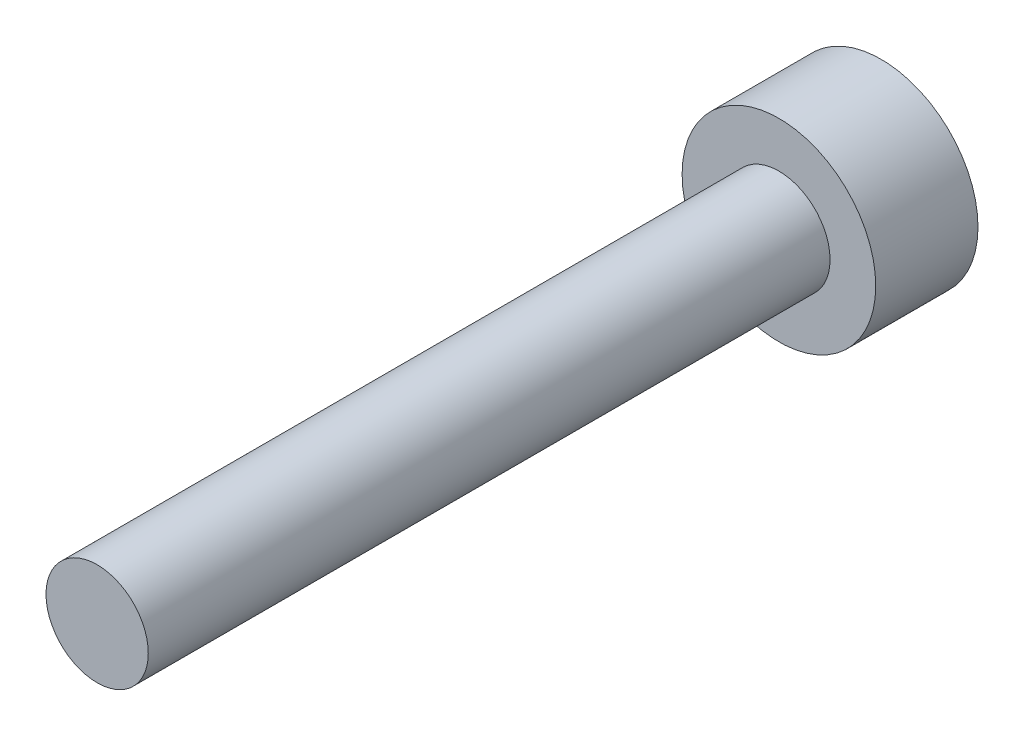
ISO-10303-21;
HEADER;
FILE_DESCRIPTION(('STEP AP214'),'2;1');
FILE_NAME('part.step','',(''),(''),'','','');
FILE_SCHEMA(('AUTOMOTIVE_DESIGN { 1 0 10303 214 1 1 1 1 }'));
ENDSEC;
DATA;
#1=APPLICATION_CONTEXT('core data for automotive mechanical design processes');
#2=APPLICATION_PROTOCOL_DEFINITION('international standard','automotive_design',2000,#1);
#3=PRODUCT_CONTEXT('',#1,'mechanical');
#4=PRODUCT('Part','Part','',(#3));
#5=PRODUCT_RELATED_PRODUCT_CATEGORY('part','',(#4));
#6=PRODUCT_DEFINITION_FORMATION('','',#4);
#7=PRODUCT_DEFINITION_CONTEXT('part definition',#1,'design');
#8=PRODUCT_DEFINITION('design','',#6,#7);
#9=PRODUCT_DEFINITION_SHAPE('','',#8);
#10=(LENGTH_UNIT() NAMED_UNIT(*) SI_UNIT(.MILLI.,.METRE.));
#11=(NAMED_UNIT(*) PLANE_ANGLE_UNIT() SI_UNIT($,.RADIAN.));
#12=(NAMED_UNIT(*) SI_UNIT($,.STERADIAN.) SOLID_ANGLE_UNIT());
#13=UNCERTAINTY_MEASURE_WITH_UNIT(LENGTH_MEASURE(1.E-05),#10,'distance_accuracy_value','');
#14=(GEOMETRIC_REPRESENTATION_CONTEXT(3) GLOBAL_UNCERTAINTY_ASSIGNED_CONTEXT((#13)) GLOBAL_UNIT_ASSIGNED_CONTEXT((#10,
#11,#12)) REPRESENTATION_CONTEXT('',''));
#15=CARTESIAN_POINT('',(0.,0.,0.));
#16=DIRECTION('',(0.,0.,1.));
#17=DIRECTION('',(1.,0.,0.));
#18=AXIS2_PLACEMENT_3D('',#15,#16,#17);
#19=CARTESIAN_POINT('',(0.,0.,-3.));
#20=DIRECTION('',(0.,0.,1.));
#21=DIRECTION('',(-1.,0.,0.));
#22=AXIS2_PLACEMENT_3D('',#19,#20,#21);
#23=CYLINDRICAL_SURFACE('',#22,2.84);
#24=CARTESIAN_POINT('',(0.,0.,-3.));
#25=DIRECTION('',(0.,0.,1.));
#26=DIRECTION('',(1.,0.,0.));
#27=AXIS2_PLACEMENT_3D('',#24,#25,#26);
#28=CIRCLE('',#27,2.84);
#29=CARTESIAN_POINT('',(2.84,0.,-3.));
#30=VERTEX_POINT('',#29);
#31=EDGE_CURVE('E46',#30,#30,#28,.T.);
#32=ORIENTED_EDGE('',*,*,#31,.T.);
#33=EDGE_LOOP('',(#32));
#34=FACE_BOUND('',#33,.T.);
#35=CARTESIAN_POINT('',(0.,0.,0.));
#36=DIRECTION('',(0.,0.,1.));
#37=DIRECTION('',(1.,0.,0.));
#38=AXIS2_PLACEMENT_3D('',#35,#36,#37);
#39=CIRCLE('',#38,2.84);
#40=CARTESIAN_POINT('',(2.84,0.,0.));
#41=VERTEX_POINT('',#40);
#42=EDGE_CURVE('E131',#41,#41,#39,.T.);
#43=ORIENTED_EDGE('',*,*,#42,.F.);
#44=EDGE_LOOP('',(#43));
#45=FACE_BOUND('',#44,.T.);
#46=ADVANCED_FACE('F39',(#34,#45),#23,.T.);
#47=CARTESIAN_POINT('',(0.,0.,-3.));
#48=DIRECTION('',(0.,0.,-1.));
#49=DIRECTION('',(1.,0.,0.));
#50=AXIS2_PLACEMENT_3D('',#47,#48,#49);
#51=PLANE('',#50);
#52=DIRECTION('',(-0.486688945822522,0.873575337343129,0.));
#53=VECTOR('',#52,1.);
#54=CARTESIAN_POINT('',(1.77803061008708,-0.027211815938925,-3.));
#55=LINE('',#54,#53);
#56=CARTESIAN_POINT('',(1.77803061008708,-0.027211815938925,-3.));
#57=VERTEX_POINT('',#56);
#58=CARTESIAN_POINT('',(0.912581428929756,1.52621376907229,-3.));
#59=VERTEX_POINT('',#58);
#60=EDGE_CURVE('E264',#57,#59,#55,.T.);
#61=ORIENTED_EDGE('',*,*,#60,.T.);
#62=DIRECTION('',(-0.999882907169972,0.0153026778481919,0.));
#63=VECTOR('',#62,1.);
#64=CARTESIAN_POINT('',(0.912581428929756,1.52621376907229,-3.));
#65=LINE('',#64,#63);
#66=CARTESIAN_POINT('',(-0.865449181157325,1.55342558501122,-3.));
#67=VERTEX_POINT('',#66);
#68=EDGE_CURVE('E261',#59,#67,#65,.T.);
#69=ORIENTED_EDGE('',*,*,#68,.T.);
#70=DIRECTION('',(-0.513193961347449,-0.858272659494938,0.));
#71=VECTOR('',#70,1.);
#72=CARTESIAN_POINT('',(-0.865449181157325,1.55342558501122,-3.));
#73=LINE('',#72,#71);
#74=CARTESIAN_POINT('',(-1.77803061008708,0.0272118159389248,-3.));
#75=VERTEX_POINT('',#74);
#76=EDGE_CURVE('E257',#67,#75,#73,.T.);
#77=ORIENTED_EDGE('',*,*,#76,.T.);
#78=DIRECTION('',(0.486688945822522,-0.873575337343129,0.));
#79=VECTOR('',#78,1.);
#80=CARTESIAN_POINT('',(-1.77803061008708,0.0272118159389248,-3.));
#81=LINE('',#80,#79);
#82=CARTESIAN_POINT('',(-0.912581428929756,-1.52621376907229,-3.));
#83=VERTEX_POINT('',#82);
#84=EDGE_CURVE('E255',#75,#83,#81,.T.);
#85=ORIENTED_EDGE('',*,*,#84,.T.);
#86=DIRECTION('',(0.999882907169972,-0.0153026778481919,0.));
#87=VECTOR('',#86,1.);
#88=CARTESIAN_POINT('',(-0.912581428929756,-1.52621376907229,-3.));
#89=LINE('',#88,#87);
#90=CARTESIAN_POINT('',(0.865449181157325,-1.55342558501122,-3.));
#91=VERTEX_POINT('',#90);
#92=EDGE_CURVE('E117',#83,#91,#89,.T.);
#93=ORIENTED_EDGE('',*,*,#92,.T.);
#94=DIRECTION('',(0.513193961347449,0.858272659494937,0.));
#95=VECTOR('',#94,1.);
#96=CARTESIAN_POINT('',(0.865449181157325,-1.55342558501122,-3.));
#97=LINE('',#96,#95);
#98=EDGE_CURVE('E251',#91,#57,#97,.T.);
#99=ORIENTED_EDGE('',*,*,#98,.T.);
#100=EDGE_LOOP('',(#61,#69,#77,#85,#93,#99));
#101=FACE_BOUND('',#100,.T.);
#102=ORIENTED_EDGE('',*,*,#31,.F.);
#103=EDGE_LOOP('',(#102));
#104=FACE_BOUND('',#103,.T.);
#105=ADVANCED_FACE('F139',(#101,#104),#51,.T.);
#106=CARTESIAN_POINT('',(0.,0.,0.));
#107=DIRECTION('',(0.,0.,-1.));
#108=DIRECTION('',(1.,0.,0.));
#109=AXIS2_PLACEMENT_3D('',#106,#107,#108);
#110=PLANE('',#109);
#111=CARTESIAN_POINT('',(0.,0.,0.));
#112=DIRECTION('',(0.,0.,1.));
#113=DIRECTION('',(1.,0.,0.));
#114=AXIS2_PLACEMENT_3D('',#111,#112,#113);
#115=CIRCLE('',#114,1.5);
#116=CARTESIAN_POINT('',(1.5,0.,0.));
#117=VERTEX_POINT('',#116);
#118=EDGE_CURVE('E11',#117,#117,#115,.F.);
#119=ORIENTED_EDGE('',*,*,#118,.T.);
#120=EDGE_LOOP('',(#119));
#121=FACE_BOUND('',#120,.T.);
#122=ORIENTED_EDGE('',*,*,#42,.T.);
#123=EDGE_LOOP('',(#122));
#124=FACE_BOUND('',#123,.T.);
#125=ADVANCED_FACE('F136',(#121,#124),#110,.F.);
#126=CARTESIAN_POINT('',(0.,0.,20.));
#127=DIRECTION('',(0.,0.,-1.));
#128=DIRECTION('',(1.,0.,0.));
#129=AXIS2_PLACEMENT_3D('',#126,#127,#128);
#130=CYLINDRICAL_SURFACE('',#129,1.5);
#131=CARTESIAN_POINT('',(0.,0.,20.));
#132=DIRECTION('',(0.,0.,-1.));
#133=DIRECTION('',(-1.,0.,0.));
#134=AXIS2_PLACEMENT_3D('',#131,#132,#133);
#135=CIRCLE('',#134,1.5);
#136=CARTESIAN_POINT('',(-1.5,0.,20.));
#137=VERTEX_POINT('',#136);
#138=EDGE_CURVE('E128',#137,#137,#135,.T.);
#139=ORIENTED_EDGE('',*,*,#138,.T.);
#140=EDGE_LOOP('',(#139));
#141=FACE_BOUND('',#140,.T.);
#142=ORIENTED_EDGE('',*,*,#118,.F.);
#143=EDGE_LOOP('',(#142));
#144=FACE_BOUND('',#143,.T.);
#145=ADVANCED_FACE('F151',(#141,#144),#130,.T.);
#146=CARTESIAN_POINT('',(0.,0.,20.));
#147=DIRECTION('',(0.,0.,1.));
#148=DIRECTION('',(-1.,0.,0.));
#149=AXIS2_PLACEMENT_3D('',#146,#147,#148);
#150=PLANE('',#149);
#151=ORIENTED_EDGE('',*,*,#138,.F.);
#152=EDGE_LOOP('',(#151));
#153=FACE_BOUND('',#152,.T.);
#154=ADVANCED_FACE('F157',(#153),#150,.T.);
#155=CARTESIAN_POINT('',(1.77803061008708,-0.027211815938925,-1.));
#156=DIRECTION('',(0.873575337343129,0.486688945822522,0.));
#157=DIRECTION('',(-0.486688945822522,0.873575337343129,0.));
#158=AXIS2_PLACEMENT_3D('',#155,#156,#157);
#159=PLANE('',#158);
#160=ORIENTED_EDGE('',*,*,#60,.F.);
#161=DIRECTION('',(0.,0.,-1.));
#162=VECTOR('',#161,1.);
#163=CARTESIAN_POINT('',(1.77803061008708,-0.027211815938925,-1.));
#164=LINE('',#163,#162);
#165=CARTESIAN_POINT('',(1.77803061008708,-0.027211815938925,-1.));
#166=VERTEX_POINT('',#165);
#167=EDGE_CURVE('E84',#166,#57,#164,.T.);
#168=ORIENTED_EDGE('',*,*,#167,.F.);
#169=DIRECTION('',(-0.486688945822522,0.873575337343129,0.));
#170=VECTOR('',#169,1.);
#171=CARTESIAN_POINT('',(1.77803061008708,-0.027211815938925,-1.));
#172=LINE('',#171,#170);
#173=CARTESIAN_POINT('',(0.912581428929756,1.52621376907229,-1.));
#174=VERTEX_POINT('',#173);
#175=EDGE_CURVE('E252',#166,#174,#172,.T.);
#176=ORIENTED_EDGE('',*,*,#175,.T.);
#177=DIRECTION('',(0.,0.,-1.));
#178=VECTOR('',#177,1.);
#179=CARTESIAN_POINT('',(0.912581428929756,1.52621376907229,-1.));
#180=LINE('',#179,#178);
#181=EDGE_CURVE('E53',#174,#59,#180,.T.);
#182=ORIENTED_EDGE('',*,*,#181,.T.);
#183=EDGE_LOOP('',(#160,#168,#176,#182));
#184=FACE_BOUND('',#183,.T.);
#185=ADVANCED_FACE('F161',(#184),#159,.F.);
#186=CARTESIAN_POINT('',(0.865449181157325,-1.55342558501122,-1.));
#187=DIRECTION('',(0.858272659494937,-0.513193961347449,0.));
#188=DIRECTION('',(0.513193961347449,0.858272659494937,0.));
#189=AXIS2_PLACEMENT_3D('',#186,#187,#188);
#190=PLANE('',#189);
#191=ORIENTED_EDGE('',*,*,#98,.F.);
#192=DIRECTION('',(0.,0.,-1.));
#193=VECTOR('',#192,1.);
#194=CARTESIAN_POINT('',(0.865449181157325,-1.55342558501122,-1.));
#195=LINE('',#194,#193);
#196=CARTESIAN_POINT('',(0.865449181157325,-1.55342558501122,-1.));
#197=VERTEX_POINT('',#196);
#198=EDGE_CURVE('E119',#197,#91,#195,.T.);
#199=ORIENTED_EDGE('',*,*,#198,.F.);
#200=DIRECTION('',(0.513193961347449,0.858272659494937,0.));
#201=VECTOR('',#200,1.);
#202=CARTESIAN_POINT('',(0.865449181157325,-1.55342558501122,-1.));
#203=LINE('',#202,#201);
#204=EDGE_CURVE('E62',#197,#166,#203,.T.);
#205=ORIENTED_EDGE('',*,*,#204,.T.);
#206=ORIENTED_EDGE('',*,*,#167,.T.);
#207=EDGE_LOOP('',(#191,#199,#205,#206));
#208=FACE_BOUND('',#207,.T.);
#209=ADVANCED_FACE('F165',(#208),#190,.F.);
#210=CARTESIAN_POINT('',(-0.912581428929756,-1.52621376907229,-1.));
#211=DIRECTION('',(-0.0153026778481919,-0.999882907169972,0.));
#212=DIRECTION('',(0.999882907169972,-0.0153026778481919,0.));
#213=AXIS2_PLACEMENT_3D('',#210,#211,#212);
#214=PLANE('',#213);
#215=ORIENTED_EDGE('',*,*,#92,.F.);
#216=DIRECTION('',(0.,0.,-1.));
#217=VECTOR('',#216,1.);
#218=CARTESIAN_POINT('',(-0.912581428929756,-1.52621376907229,-1.));
#219=LINE('',#218,#217);
#220=CARTESIAN_POINT('',(-0.912581428929756,-1.52621376907229,-1.));
#221=VERTEX_POINT('',#220);
#222=EDGE_CURVE('E106',#221,#83,#219,.T.);
#223=ORIENTED_EDGE('',*,*,#222,.F.);
#224=DIRECTION('',(0.999882907169972,-0.0153026778481919,0.));
#225=VECTOR('',#224,1.);
#226=CARTESIAN_POINT('',(-0.912581428929756,-1.52621376907229,-1.));
#227=LINE('',#226,#225);
#228=EDGE_CURVE('E109',#221,#197,#227,.T.);
#229=ORIENTED_EDGE('',*,*,#228,.T.);
#230=ORIENTED_EDGE('',*,*,#198,.T.);
#231=EDGE_LOOP('',(#215,#223,#229,#230));
#232=FACE_BOUND('',#231,.T.);
#233=ADVANCED_FACE('F115',(#232),#214,.F.);
#234=CARTESIAN_POINT('',(-1.77803061008708,0.0272118159389248,-1.));
#235=DIRECTION('',(-0.873575337343129,-0.486688945822522,0.));
#236=DIRECTION('',(0.486688945822522,-0.873575337343129,0.));
#237=AXIS2_PLACEMENT_3D('',#234,#235,#236);
#238=PLANE('',#237);
#239=ORIENTED_EDGE('',*,*,#84,.F.);
#240=DIRECTION('',(0.,0.,-1.));
#241=VECTOR('',#240,1.);
#242=CARTESIAN_POINT('',(-1.77803061008708,0.0272118159389248,-1.));
#243=LINE('',#242,#241);
#244=CARTESIAN_POINT('',(-1.77803061008708,0.0272118159389248,-1.));
#245=VERTEX_POINT('',#244);
#246=EDGE_CURVE('E108',#245,#75,#243,.T.);
#247=ORIENTED_EDGE('',*,*,#246,.F.);
#248=DIRECTION('',(0.486688945822522,-0.873575337343129,0.));
#249=VECTOR('',#248,1.);
#250=CARTESIAN_POINT('',(-1.77803061008708,0.0272118159389248,-1.));
#251=LINE('',#250,#249);
#252=EDGE_CURVE('E101',#245,#221,#251,.T.);
#253=ORIENTED_EDGE('',*,*,#252,.T.);
#254=ORIENTED_EDGE('',*,*,#222,.T.);
#255=EDGE_LOOP('',(#239,#247,#253,#254));
#256=FACE_BOUND('',#255,.T.);
#257=ADVANCED_FACE('F104',(#256),#238,.F.);
#258=CARTESIAN_POINT('',(-0.865449181157325,1.55342558501122,-1.));
#259=DIRECTION('',(-0.858272659494937,0.513193961347449,0.));
#260=DIRECTION('',(-0.513193961347449,-0.858272659494938,0.));
#261=AXIS2_PLACEMENT_3D('',#258,#259,#260);
#262=PLANE('',#261);
#263=ORIENTED_EDGE('',*,*,#76,.F.);
#264=DIRECTION('',(0.,0.,-1.));
#265=VECTOR('',#264,1.);
#266=CARTESIAN_POINT('',(-0.865449181157325,1.55342558501122,-1.));
#267=LINE('',#266,#265);
#268=CARTESIAN_POINT('',(-0.865449181157325,1.55342558501122,-1.));
#269=VERTEX_POINT('',#268);
#270=EDGE_CURVE('E122',#269,#67,#267,.T.);
#271=ORIENTED_EDGE('',*,*,#270,.F.);
#272=DIRECTION('',(-0.513193961347449,-0.858272659494938,0.));
#273=VECTOR('',#272,1.);
#274=CARTESIAN_POINT('',(-0.865449181157325,1.55342558501122,-1.));
#275=LINE('',#274,#273);
#276=EDGE_CURVE('E110',#269,#245,#275,.T.);
#277=ORIENTED_EDGE('',*,*,#276,.T.);
#278=ORIENTED_EDGE('',*,*,#246,.T.);
#279=EDGE_LOOP('',(#263,#271,#277,#278));
#280=FACE_BOUND('',#279,.T.);
#281=ADVANCED_FACE('F169',(#280),#262,.F.);
#282=CARTESIAN_POINT('',(0.912581428929756,1.52621376907229,-1.));
#283=DIRECTION('',(0.0153026778481919,0.999882907169972,0.));
#284=DIRECTION('',(-0.999882907169972,0.0153026778481919,0.));
#285=AXIS2_PLACEMENT_3D('',#282,#283,#284);
#286=PLANE('',#285);
#287=ORIENTED_EDGE('',*,*,#68,.F.);
#288=ORIENTED_EDGE('',*,*,#181,.F.);
#289=DIRECTION('',(-0.999882907169972,0.0153026778481919,0.));
#290=VECTOR('',#289,1.);
#291=CARTESIAN_POINT('',(0.912581428929756,1.52621376907229,-1.));
#292=LINE('',#291,#290);
#293=EDGE_CURVE('E92',#174,#269,#292,.T.);
#294=ORIENTED_EDGE('',*,*,#293,.T.);
#295=ORIENTED_EDGE('',*,*,#270,.T.);
#296=EDGE_LOOP('',(#287,#288,#294,#295));
#297=FACE_BOUND('',#296,.T.);
#298=ADVANCED_FACE('F166',(#297),#286,.F.);
#299=CARTESIAN_POINT('',(0.,0.,-1.));
#300=DIRECTION('',(0.,0.,-1.));
#301=DIRECTION('',(1.,0.,0.));
#302=AXIS2_PLACEMENT_3D('',#299,#300,#301);
#303=PLANE('',#302);
#304=ORIENTED_EDGE('',*,*,#175,.F.);
#305=ORIENTED_EDGE('',*,*,#204,.F.);
#306=ORIENTED_EDGE('',*,*,#228,.F.);
#307=ORIENTED_EDGE('',*,*,#252,.F.);
#308=ORIENTED_EDGE('',*,*,#276,.F.);
#309=ORIENTED_EDGE('',*,*,#293,.F.);
#310=EDGE_LOOP('',(#304,#305,#306,#307,#308,#309));
#311=FACE_BOUND('',#310,.T.);
#312=ADVANCED_FACE('F112',(#311),#303,.T.);
#313=CLOSED_SHELL('',(#46,#105,#125,#145,#154,#185,#209,#233,#257,#281,#298,#312));
#314=MANIFOLD_SOLID_BREP('B2',#313);
#315=ADVANCED_BREP_SHAPE_REPRESENTATION('',(#18,#314),#14);
#316=SHAPE_DEFINITION_REPRESENTATION(#9,#315);
ENDSEC;
END-ISO-10303-21;
